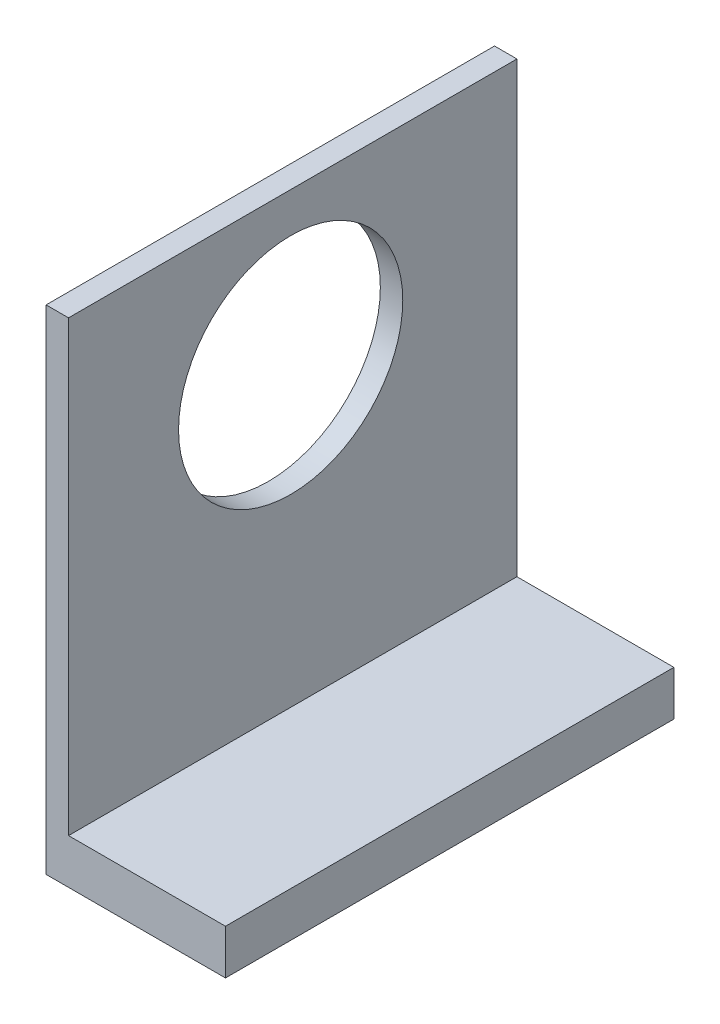
ISO-10303-21;
HEADER;
FILE_DESCRIPTION(('STEP AP214'),'2;1');
FILE_NAME('part.step','',(''),(''),'','','');
FILE_SCHEMA(('AUTOMOTIVE_DESIGN { 1 0 10303 214 1 1 1 1 }'));
ENDSEC;
DATA;
#1=APPLICATION_CONTEXT('core data for automotive mechanical design processes');
#2=APPLICATION_PROTOCOL_DEFINITION('international standard','automotive_design',2000,#1);
#3=PRODUCT_CONTEXT('',#1,'mechanical');
#4=PRODUCT('Part','Part','',(#3));
#5=PRODUCT_RELATED_PRODUCT_CATEGORY('part','',(#4));
#6=PRODUCT_DEFINITION_FORMATION('','',#4);
#7=PRODUCT_DEFINITION_CONTEXT('part definition',#1,'design');
#8=PRODUCT_DEFINITION('design','',#6,#7);
#9=PRODUCT_DEFINITION_SHAPE('','',#8);
#10=(LENGTH_UNIT() NAMED_UNIT(*) SI_UNIT(.MILLI.,.METRE.));
#11=(NAMED_UNIT(*) PLANE_ANGLE_UNIT() SI_UNIT($,.RADIAN.));
#12=(NAMED_UNIT(*) SI_UNIT($,.STERADIAN.) SOLID_ANGLE_UNIT());
#13=UNCERTAINTY_MEASURE_WITH_UNIT(LENGTH_MEASURE(1.E-05),#10,'distance_accuracy_value','');
#14=(GEOMETRIC_REPRESENTATION_CONTEXT(3) GLOBAL_UNCERTAINTY_ASSIGNED_CONTEXT((#13)) GLOBAL_UNIT_ASSIGNED_CONTEXT((#10,
#11,#12)) REPRESENTATION_CONTEXT('',''));
#15=CARTESIAN_POINT('',(0.,0.,0.));
#16=DIRECTION('',(0.,0.,1.));
#17=DIRECTION('',(1.,0.,0.));
#18=AXIS2_PLACEMENT_3D('',#15,#16,#17);
#19=CARTESIAN_POINT('',(0.,0.,20.));
#20=DIRECTION('',(1.,0.,0.));
#21=DIRECTION('',(0.,0.,-1.));
#22=AXIS2_PLACEMENT_3D('',#19,#20,#21);
#23=PLANE('',#22);
#24=CARTESIAN_POINT('',(0.,15.2223725740782,10.0929621167798));
#25=DIRECTION('',(1.,0.,0.));
#26=DIRECTION('',(0.,0.,-1.));
#27=AXIS2_PLACEMENT_3D('',#24,#25,#26);
#28=CIRCLE('',#27,5.);
#29=CARTESIAN_POINT('',(0.,15.2223725740782,5.09296211677981));
#30=VERTEX_POINT('',#29);
#31=EDGE_CURVE('E125',#30,#30,#28,.T.);
#32=ORIENTED_EDGE('',*,*,#31,.T.);
#33=EDGE_LOOP('',(#32));
#34=FACE_BOUND('',#33,.T.);
#35=DIRECTION('',(0.,-1.,0.));
#36=VECTOR('',#35,1.);
#37=CARTESIAN_POINT('',(0.,0.,0.));
#38=LINE('',#37,#36);
#39=CARTESIAN_POINT('',(0.,22.,0.));
#40=VERTEX_POINT('',#39);
#41=CARTESIAN_POINT('',(0.,0.,0.));
#42=VERTEX_POINT('',#41);
#43=EDGE_CURVE('E121',#40,#42,#38,.T.);
#44=ORIENTED_EDGE('',*,*,#43,.T.);
#45=DIRECTION('',(0.,0.,-1.));
#46=VECTOR('',#45,1.);
#47=CARTESIAN_POINT('',(0.,0.,20.));
#48=LINE('',#47,#46);
#49=CARTESIAN_POINT('',(0.,0.,20.));
#50=VERTEX_POINT('',#49);
#51=EDGE_CURVE('E11',#50,#42,#48,.T.);
#52=ORIENTED_EDGE('',*,*,#51,.F.);
#53=DIRECTION('',(0.,-1.,0.));
#54=VECTOR('',#53,1.);
#55=CARTESIAN_POINT('',(0.,0.,20.));
#56=LINE('',#55,#54);
#57=CARTESIAN_POINT('',(0.,22.,20.));
#58=VERTEX_POINT('',#57);
#59=EDGE_CURVE('E132',#58,#50,#56,.T.);
#60=ORIENTED_EDGE('',*,*,#59,.F.);
#61=DIRECTION('',(0.,0.,-1.));
#62=VECTOR('',#61,1.);
#63=CARTESIAN_POINT('',(0.,22.,20.));
#64=LINE('',#63,#62);
#65=EDGE_CURVE('E117',#58,#40,#64,.T.);
#66=ORIENTED_EDGE('',*,*,#65,.T.);
#67=EDGE_LOOP('',(#44,#52,#60,#66));
#68=FACE_BOUND('',#67,.T.);
#69=ADVANCED_FACE('F37',(#34,#68),#23,.F.);
#70=CARTESIAN_POINT('',(0.,0.,20.));
#71=DIRECTION('',(0.,1.,0.));
#72=DIRECTION('',(0.,0.,1.));
#73=AXIS2_PLACEMENT_3D('',#70,#71,#72);
#74=PLANE('',#73);
#75=DIRECTION('',(1.,0.,0.));
#76=VECTOR('',#75,1.);
#77=CARTESIAN_POINT('',(0.,0.,0.));
#78=LINE('',#77,#76);
#79=CARTESIAN_POINT('',(8.,0.,0.));
#80=VERTEX_POINT('',#79);
#81=EDGE_CURVE('E124',#42,#80,#78,.T.);
#82=ORIENTED_EDGE('',*,*,#81,.T.);
#83=DIRECTION('',(0.,0.,-1.));
#84=VECTOR('',#83,1.);
#85=CARTESIAN_POINT('',(8.,0.,20.));
#86=LINE('',#85,#84);
#87=CARTESIAN_POINT('',(8.,0.,20.));
#88=VERTEX_POINT('',#87);
#89=EDGE_CURVE('E45',#88,#80,#86,.T.);
#90=ORIENTED_EDGE('',*,*,#89,.F.);
#91=DIRECTION('',(1.,0.,0.));
#92=VECTOR('',#91,1.);
#93=CARTESIAN_POINT('',(0.,0.,20.));
#94=LINE('',#93,#92);
#95=EDGE_CURVE('E90',#50,#88,#94,.T.);
#96=ORIENTED_EDGE('',*,*,#95,.F.);
#97=ORIENTED_EDGE('',*,*,#51,.T.);
#98=EDGE_LOOP('',(#82,#90,#96,#97));
#99=FACE_BOUND('',#98,.T.);
#100=ADVANCED_FACE('F157',(#99),#74,.F.);
#101=CARTESIAN_POINT('',(8.,0.,20.));
#102=DIRECTION('',(-1.,0.,0.));
#103=DIRECTION('',(0.,0.,1.));
#104=AXIS2_PLACEMENT_3D('',#101,#102,#103);
#105=PLANE('',#104);
#106=DIRECTION('',(0.,1.,0.));
#107=VECTOR('',#106,1.);
#108=CARTESIAN_POINT('',(8.,0.,0.));
#109=LINE('',#108,#107);
#110=CARTESIAN_POINT('',(8.,2.,0.));
#111=VERTEX_POINT('',#110);
#112=EDGE_CURVE('E127',#80,#111,#109,.T.);
#113=ORIENTED_EDGE('',*,*,#112,.T.);
#114=DIRECTION('',(0.,0.,-1.));
#115=VECTOR('',#114,1.);
#116=CARTESIAN_POINT('',(8.,2.,20.));
#117=LINE('',#116,#115);
#118=CARTESIAN_POINT('',(8.,2.,20.));
#119=VERTEX_POINT('',#118);
#120=EDGE_CURVE('E112',#119,#111,#117,.T.);
#121=ORIENTED_EDGE('',*,*,#120,.F.);
#122=DIRECTION('',(0.,1.,0.));
#123=VECTOR('',#122,1.);
#124=CARTESIAN_POINT('',(8.,0.,20.));
#125=LINE('',#124,#123);
#126=EDGE_CURVE('E103',#88,#119,#125,.T.);
#127=ORIENTED_EDGE('',*,*,#126,.F.);
#128=ORIENTED_EDGE('',*,*,#89,.T.);
#129=EDGE_LOOP('',(#113,#121,#127,#128));
#130=FACE_BOUND('',#129,.T.);
#131=ADVANCED_FACE('F138',(#130),#105,.F.);
#132=CARTESIAN_POINT('',(8.,2.,20.));
#133=DIRECTION('',(0.,-1.,0.));
#134=DIRECTION('',(1.,0.,0.));
#135=AXIS2_PLACEMENT_3D('',#132,#133,#134);
#136=PLANE('',#135);
#137=DIRECTION('',(-1.,0.,0.));
#138=VECTOR('',#137,1.);
#139=CARTESIAN_POINT('',(8.,2.,0.));
#140=LINE('',#139,#138);
#141=CARTESIAN_POINT('',(1.,2.,0.));
#142=VERTEX_POINT('',#141);
#143=EDGE_CURVE('E111',#111,#142,#140,.T.);
#144=ORIENTED_EDGE('',*,*,#143,.T.);
#145=DIRECTION('',(0.,0.,-1.));
#146=VECTOR('',#145,1.);
#147=CARTESIAN_POINT('',(1.,2.,20.));
#148=LINE('',#147,#146);
#149=CARTESIAN_POINT('',(1.,2.,20.));
#150=VERTEX_POINT('',#149);
#151=EDGE_CURVE('E108',#150,#142,#148,.T.);
#152=ORIENTED_EDGE('',*,*,#151,.F.);
#153=DIRECTION('',(-1.,0.,0.));
#154=VECTOR('',#153,1.);
#155=CARTESIAN_POINT('',(8.,2.,20.));
#156=LINE('',#155,#154);
#157=EDGE_CURVE('E97',#119,#150,#156,.T.);
#158=ORIENTED_EDGE('',*,*,#157,.F.);
#159=ORIENTED_EDGE('',*,*,#120,.T.);
#160=EDGE_LOOP('',(#144,#152,#158,#159));
#161=FACE_BOUND('',#160,.T.);
#162=ADVANCED_FACE('F109',(#161),#136,.F.);
#163=CARTESIAN_POINT('',(1.,2.,20.));
#164=DIRECTION('',(-1.,0.,0.));
#165=DIRECTION('',(0.,0.,1.));
#166=AXIS2_PLACEMENT_3D('',#163,#164,#165);
#167=PLANE('',#166);
#168=CARTESIAN_POINT('',(1.,15.2223725740782,10.0929621167798));
#169=DIRECTION('',(1.,0.,0.));
#170=DIRECTION('',(0.,0.,-1.));
#171=AXIS2_PLACEMENT_3D('',#168,#169,#170);
#172=CIRCLE('',#171,5.);
#173=CARTESIAN_POINT('',(1.,15.2223725740782,5.09296211677981));
#174=VERTEX_POINT('',#173);
#175=EDGE_CURVE('E165',#174,#174,#172,.T.);
#176=ORIENTED_EDGE('',*,*,#175,.F.);
#177=EDGE_LOOP('',(#176));
#178=FACE_BOUND('',#177,.T.);
#179=DIRECTION('',(0.,1.,0.));
#180=VECTOR('',#179,1.);
#181=CARTESIAN_POINT('',(1.,2.,0.));
#182=LINE('',#181,#180);
#183=CARTESIAN_POINT('',(1.,22.,0.));
#184=VERTEX_POINT('',#183);
#185=EDGE_CURVE('E76',#142,#184,#182,.T.);
#186=ORIENTED_EDGE('',*,*,#185,.T.);
#187=DIRECTION('',(0.,0.,-1.));
#188=VECTOR('',#187,1.);
#189=CARTESIAN_POINT('',(1.,22.,20.));
#190=LINE('',#189,#188);
#191=CARTESIAN_POINT('',(1.,22.,20.));
#192=VERTEX_POINT('',#191);
#193=EDGE_CURVE('E113',#192,#184,#190,.T.);
#194=ORIENTED_EDGE('',*,*,#193,.F.);
#195=DIRECTION('',(0.,1.,0.));
#196=VECTOR('',#195,1.);
#197=CARTESIAN_POINT('',(1.,2.,20.));
#198=LINE('',#197,#196);
#199=EDGE_CURVE('E101',#150,#192,#198,.T.);
#200=ORIENTED_EDGE('',*,*,#199,.F.);
#201=ORIENTED_EDGE('',*,*,#151,.T.);
#202=EDGE_LOOP('',(#186,#194,#200,#201));
#203=FACE_BOUND('',#202,.T.);
#204=ADVANCED_FACE('F115',(#178,#203),#167,.F.);
#205=CARTESIAN_POINT('',(1.,22.,20.));
#206=DIRECTION('',(0.,-1.,0.));
#207=DIRECTION('',(0.,0.,-1.));
#208=AXIS2_PLACEMENT_3D('',#205,#206,#207);
#209=PLANE('',#208);
#210=DIRECTION('',(-1.,0.,0.));
#211=VECTOR('',#210,1.);
#212=CARTESIAN_POINT('',(1.,22.,0.));
#213=LINE('',#212,#211);
#214=EDGE_CURVE('E82',#184,#40,#213,.T.);
#215=ORIENTED_EDGE('',*,*,#214,.T.);
#216=ORIENTED_EDGE('',*,*,#65,.F.);
#217=DIRECTION('',(-1.,0.,0.));
#218=VECTOR('',#217,1.);
#219=CARTESIAN_POINT('',(1.,22.,20.));
#220=LINE('',#219,#218);
#221=EDGE_CURVE('E53',#192,#58,#220,.T.);
#222=ORIENTED_EDGE('',*,*,#221,.F.);
#223=ORIENTED_EDGE('',*,*,#193,.T.);
#224=EDGE_LOOP('',(#215,#216,#222,#223));
#225=FACE_BOUND('',#224,.T.);
#226=ADVANCED_FACE('F145',(#225),#209,.F.);
#227=CARTESIAN_POINT('',(0.,0.,20.));
#228=DIRECTION('',(0.,0.,1.));
#229=DIRECTION('',(1.,0.,0.));
#230=AXIS2_PLACEMENT_3D('',#227,#228,#229);
#231=PLANE('',#230);
#232=ORIENTED_EDGE('',*,*,#59,.T.);
#233=ORIENTED_EDGE('',*,*,#95,.T.);
#234=ORIENTED_EDGE('',*,*,#126,.T.);
#235=ORIENTED_EDGE('',*,*,#157,.T.);
#236=ORIENTED_EDGE('',*,*,#199,.T.);
#237=ORIENTED_EDGE('',*,*,#221,.T.);
#238=EDGE_LOOP('',(#232,#233,#234,#235,#236,#237));
#239=FACE_BOUND('',#238,.T.);
#240=ADVANCED_FACE('F99',(#239),#231,.T.);
#241=CARTESIAN_POINT('',(0.,0.,0.));
#242=DIRECTION('',(0.,0.,1.));
#243=DIRECTION('',(1.,0.,0.));
#244=AXIS2_PLACEMENT_3D('',#241,#242,#243);
#245=PLANE('',#244);
#246=ORIENTED_EDGE('',*,*,#43,.F.);
#247=ORIENTED_EDGE('',*,*,#214,.F.);
#248=ORIENTED_EDGE('',*,*,#185,.F.);
#249=ORIENTED_EDGE('',*,*,#143,.F.);
#250=ORIENTED_EDGE('',*,*,#112,.F.);
#251=ORIENTED_EDGE('',*,*,#81,.F.);
#252=EDGE_LOOP('',(#246,#247,#248,#249,#250,#251));
#253=FACE_BOUND('',#252,.T.);
#254=ADVANCED_FACE('F141',(#253),#245,.F.);
#255=CARTESIAN_POINT('',(-9.,15.2223725740782,10.0929621167798));
#256=DIRECTION('',(1.,0.,0.));
#257=DIRECTION('',(0.,0.,-1.));
#258=AXIS2_PLACEMENT_3D('',#255,#256,#257);
#259=CYLINDRICAL_SURFACE('',#258,5.);
#260=ORIENTED_EDGE('',*,*,#175,.T.);
#261=EDGE_LOOP('',(#260));
#262=FACE_BOUND('',#261,.T.);
#263=ORIENTED_EDGE('',*,*,#31,.F.);
#264=EDGE_LOOP('',(#263));
#265=FACE_BOUND('',#264,.T.);
#266=ADVANCED_FACE('F173',(#262,#265),#259,.F.);
#267=CLOSED_SHELL('',(#69,#100,#131,#162,#204,#226,#240,#254,#266));
#268=MANIFOLD_SOLID_BREP('B2',#267);
#269=ADVANCED_BREP_SHAPE_REPRESENTATION('',(#18,#268),#14);
#270=SHAPE_DEFINITION_REPRESENTATION(#9,#269);
ENDSEC;
END-ISO-10303-21;
